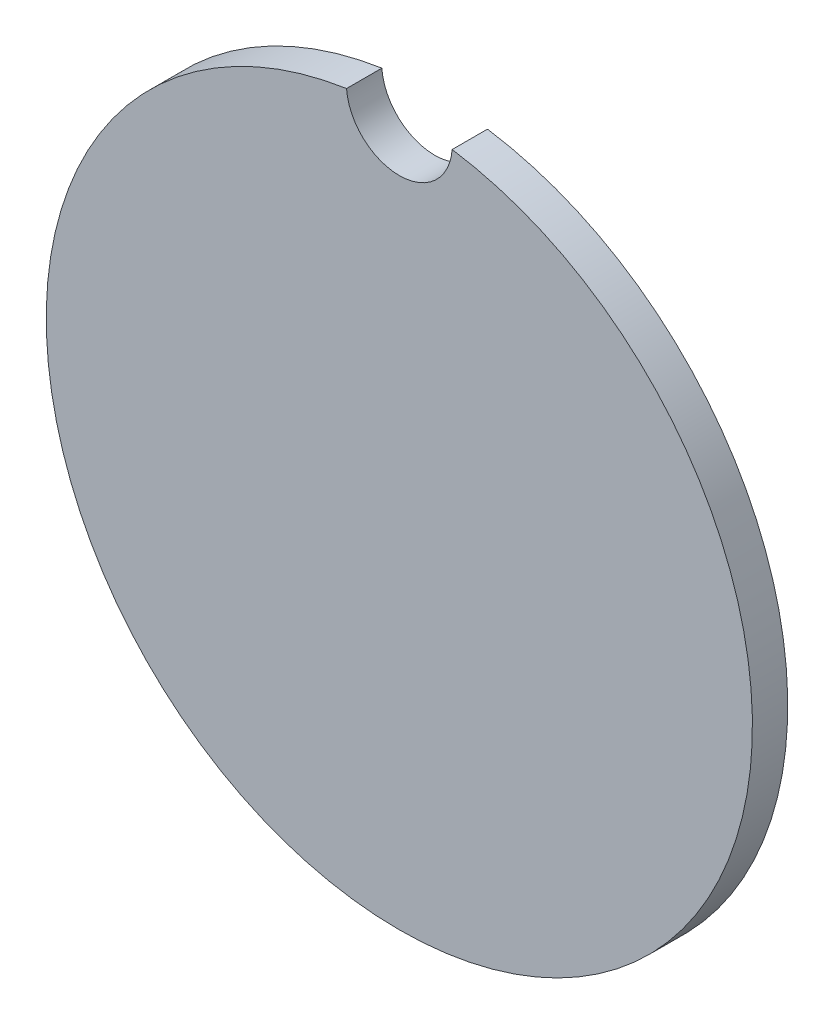
ISO-10303-21;
HEADER;
FILE_DESCRIPTION(('STEP AP214'),'2;1');
FILE_NAME('part.step','',(''),(''),'','','');
FILE_SCHEMA(('AUTOMOTIVE_DESIGN { 1 0 10303 214 1 1 1 1 }'));
ENDSEC;
DATA;
#1=APPLICATION_CONTEXT('core data for automotive mechanical design processes');
#2=APPLICATION_PROTOCOL_DEFINITION('international standard','automotive_design',2000,#1);
#3=PRODUCT_CONTEXT('',#1,'mechanical');
#4=PRODUCT('Part','Part','',(#3));
#5=PRODUCT_RELATED_PRODUCT_CATEGORY('part','',(#4));
#6=PRODUCT_DEFINITION_FORMATION('','',#4);
#7=PRODUCT_DEFINITION_CONTEXT('part definition',#1,'design');
#8=PRODUCT_DEFINITION('design','',#6,#7);
#9=PRODUCT_DEFINITION_SHAPE('','',#8);
#10=(LENGTH_UNIT() NAMED_UNIT(*) SI_UNIT(.MILLI.,.METRE.));
#11=(NAMED_UNIT(*) PLANE_ANGLE_UNIT() SI_UNIT($,.RADIAN.));
#12=(NAMED_UNIT(*) SI_UNIT($,.STERADIAN.) SOLID_ANGLE_UNIT());
#13=UNCERTAINTY_MEASURE_WITH_UNIT(LENGTH_MEASURE(1.E-05),#10,'distance_accuracy_value','');
#14=(GEOMETRIC_REPRESENTATION_CONTEXT(3) GLOBAL_UNCERTAINTY_ASSIGNED_CONTEXT((#13)) GLOBAL_UNIT_ASSIGNED_CONTEXT((#10,
#11,#12)) REPRESENTATION_CONTEXT('',''));
#15=CARTESIAN_POINT('',(0.,0.,0.));
#16=DIRECTION('',(0.,0.,1.));
#17=DIRECTION('',(1.,0.,0.));
#18=AXIS2_PLACEMENT_3D('',#15,#16,#17);
#19=CARTESIAN_POINT('',(0.,5.,0.5));
#20=DIRECTION('',(0.,0.,-1.));
#21=DIRECTION('',(-1.,0.,0.));
#22=AXIS2_PLACEMENT_3D('',#19,#20,#21);
#23=CYLINDRICAL_SURFACE('',#22,0.749999999999999);
#24=CARTESIAN_POINT('',(0.,5.,0.));
#25=DIRECTION('',(0.,0.,-1.));
#26=DIRECTION('',(1.,0.,0.));
#27=AXIS2_PLACEMENT_3D('',#24,#25,#26);
#28=CIRCLE('',#27,0.749999999999999);
#29=CARTESIAN_POINT('',(0.747887650319216,4.94375,0.));
#30=VERTEX_POINT('',#29);
#31=CARTESIAN_POINT('',(-0.747887650319217,4.94375,0.));
#32=VERTEX_POINT('',#31);
#33=EDGE_CURVE('E69',#30,#32,#28,.T.);
#34=ORIENTED_EDGE('',*,*,#33,.T.);
#35=DIRECTION('',(0.,0.,-1.));
#36=VECTOR('',#35,1.);
#37=CARTESIAN_POINT('',(-0.747887650319217,4.94375,0.5));
#38=LINE('',#37,#36);
#39=CARTESIAN_POINT('',(-0.747887650319217,4.94375,0.5));
#40=VERTEX_POINT('',#39);
#41=EDGE_CURVE('E11',#40,#32,#38,.T.);
#42=ORIENTED_EDGE('',*,*,#41,.F.);
#43=CARTESIAN_POINT('',(0.,5.,0.5));
#44=DIRECTION('',(0.,0.,-1.));
#45=DIRECTION('',(1.,0.,0.));
#46=AXIS2_PLACEMENT_3D('',#43,#44,#45);
#47=CIRCLE('',#46,0.749999999999999);
#48=CARTESIAN_POINT('',(0.747887650319216,4.94375,0.5));
#49=VERTEX_POINT('',#48);
#50=EDGE_CURVE('E68',#49,#40,#47,.T.);
#51=ORIENTED_EDGE('',*,*,#50,.F.);
#52=DIRECTION('',(0.,0.,-1.));
#53=VECTOR('',#52,1.);
#54=CARTESIAN_POINT('',(0.747887650319216,4.94375,0.5));
#55=LINE('',#54,#53);
#56=EDGE_CURVE('E46',#49,#30,#55,.T.);
#57=ORIENTED_EDGE('',*,*,#56,.T.);
#58=EDGE_LOOP('',(#34,#42,#51,#57));
#59=FACE_BOUND('',#58,.T.);
#60=ADVANCED_FACE('F38',(#59),#23,.F.);
#61=CARTESIAN_POINT('',(0.,0.,0.5));
#62=DIRECTION('',(0.,0.,-1.));
#63=DIRECTION('',(-1.,0.,0.));
#64=AXIS2_PLACEMENT_3D('',#61,#62,#63);
#65=CYLINDRICAL_SURFACE('',#64,5.);
#66=CARTESIAN_POINT('',(0.,0.,0.));
#67=DIRECTION('',(0.,0.,1.));
#68=DIRECTION('',(1.,0.,0.));
#69=AXIS2_PLACEMENT_3D('',#66,#67,#68);
#70=CIRCLE('',#69,5.);
#71=EDGE_CURVE('E61',#32,#30,#70,.T.);
#72=ORIENTED_EDGE('',*,*,#71,.T.);
#73=ORIENTED_EDGE('',*,*,#56,.F.);
#74=CARTESIAN_POINT('',(0.,0.,0.5));
#75=DIRECTION('',(0.,0.,1.));
#76=DIRECTION('',(1.,0.,0.));
#77=AXIS2_PLACEMENT_3D('',#74,#75,#76);
#78=CIRCLE('',#77,5.);
#79=EDGE_CURVE('E53',#40,#49,#78,.T.);
#80=ORIENTED_EDGE('',*,*,#79,.F.);
#81=ORIENTED_EDGE('',*,*,#41,.T.);
#82=EDGE_LOOP('',(#72,#73,#80,#81));
#83=FACE_BOUND('',#82,.T.);
#84=ADVANCED_FACE('F64',(#83),#65,.T.);
#85=CARTESIAN_POINT('',(0.,2.5,0.5));
#86=DIRECTION('',(0.,0.,1.));
#87=DIRECTION('',(1.,0.,0.));
#88=AXIS2_PLACEMENT_3D('',#85,#86,#87);
#89=PLANE('',#88);
#90=ORIENTED_EDGE('',*,*,#50,.T.);
#91=ORIENTED_EDGE('',*,*,#79,.T.);
#92=EDGE_LOOP('',(#90,#91));
#93=FACE_BOUND('',#92,.T.);
#94=ADVANCED_FACE('F76',(#93),#89,.T.);
#95=CARTESIAN_POINT('',(0.,2.5,0.));
#96=DIRECTION('',(0.,0.,1.));
#97=DIRECTION('',(1.,0.,0.));
#98=AXIS2_PLACEMENT_3D('',#95,#96,#97);
#99=PLANE('',#98);
#100=ORIENTED_EDGE('',*,*,#33,.F.);
#101=ORIENTED_EDGE('',*,*,#71,.F.);
#102=EDGE_LOOP('',(#100,#101));
#103=FACE_BOUND('',#102,.T.);
#104=ADVANCED_FACE('F72',(#103),#99,.F.);
#105=CLOSED_SHELL('',(#60,#84,#94,#104));
#106=MANIFOLD_SOLID_BREP('B2',#105);
#107=ADVANCED_BREP_SHAPE_REPRESENTATION('',(#18,#106),#14);
#108=SHAPE_DEFINITION_REPRESENTATION(#9,#107);
ENDSEC;
END-ISO-10303-21;
